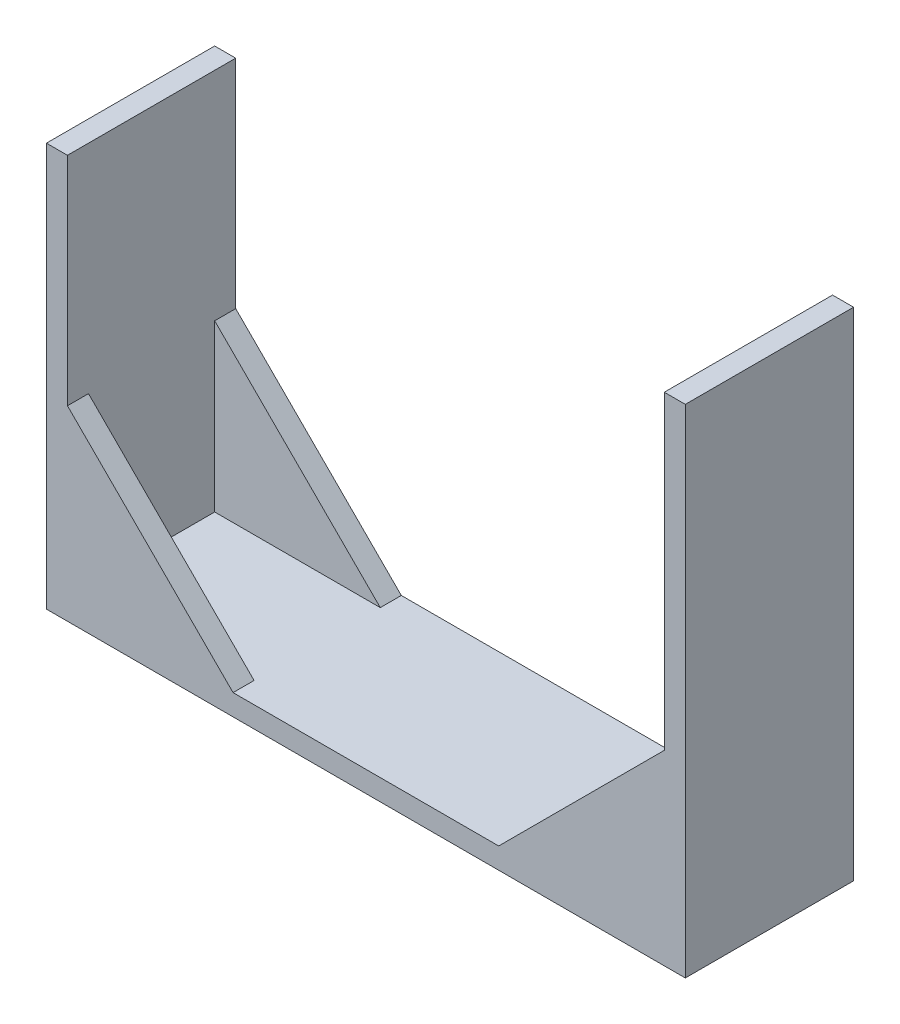
ISO-10303-21;
HEADER;
FILE_DESCRIPTION(('STEP AP214'),'2;1');
FILE_NAME('part.step','',(''),(''),'','','');
FILE_SCHEMA(('AUTOMOTIVE_DESIGN { 1 0 10303 214 1 1 1 1 }'));
ENDSEC;
DATA;
#1=APPLICATION_CONTEXT('core data for automotive mechanical design processes');
#2=APPLICATION_PROTOCOL_DEFINITION('international standard','automotive_design',2000,#1);
#3=PRODUCT_CONTEXT('',#1,'mechanical');
#4=PRODUCT('Part','Part','',(#3));
#5=PRODUCT_RELATED_PRODUCT_CATEGORY('part','',(#4));
#6=PRODUCT_DEFINITION_FORMATION('','',#4);
#7=PRODUCT_DEFINITION_CONTEXT('part definition',#1,'design');
#8=PRODUCT_DEFINITION('design','',#6,#7);
#9=PRODUCT_DEFINITION_SHAPE('','',#8);
#10=(LENGTH_UNIT() NAMED_UNIT(*) SI_UNIT(.MILLI.,.METRE.));
#11=(NAMED_UNIT(*) PLANE_ANGLE_UNIT() SI_UNIT($,.RADIAN.));
#12=(NAMED_UNIT(*) SI_UNIT($,.STERADIAN.) SOLID_ANGLE_UNIT());
#13=UNCERTAINTY_MEASURE_WITH_UNIT(LENGTH_MEASURE(1.E-05),#10,'distance_accuracy_value','');
#14=(GEOMETRIC_REPRESENTATION_CONTEXT(3) GLOBAL_UNCERTAINTY_ASSIGNED_CONTEXT((#13)) GLOBAL_UNIT_ASSIGNED_CONTEXT((#10,
#11,#12)) REPRESENTATION_CONTEXT('',''));
#15=CARTESIAN_POINT('',(0.,0.,0.));
#16=DIRECTION('',(0.,0.,1.));
#17=DIRECTION('',(1.,0.,0.));
#18=AXIS2_PLACEMENT_3D('',#15,#16,#17);
#19=CARTESIAN_POINT('',(12.7,12.7,50.8));
#20=DIRECTION('',(0.,-1.,0.));
#21=DIRECTION('',(0.,0.,-1.));
#22=AXIS2_PLACEMENT_3D('',#19,#20,#21);
#23=PLANE('',#22);
#24=DIRECTION('',(0.,0.,-1.));
#25=VECTOR('',#24,1.);
#26=CARTESIAN_POINT('',(112.699999999999,12.7,-38.1));
#27=LINE('',#26,#25);
#28=CARTESIAN_POINT('',(112.699999999999,12.7,-38.1));
#29=VERTEX_POINT('',#28);
#30=CARTESIAN_POINT('',(112.699999999999,12.7,-50.8));
#31=VERTEX_POINT('',#30);
#32=EDGE_CURVE('E48',#29,#31,#27,.T.);
#33=ORIENTED_EDGE('',*,*,#32,.F.);
#34=DIRECTION('',(1.,0.,0.));
#35=VECTOR('',#34,1.);
#36=CARTESIAN_POINT('',(112.699999999999,12.7,-38.1));
#37=LINE('',#36,#35);
#38=CARTESIAN_POINT('',(12.7,12.7,-38.1));
#39=VERTEX_POINT('',#38);
#40=EDGE_CURVE('E165',#39,#29,#37,.T.);
#41=ORIENTED_EDGE('',*,*,#40,.F.);
#42=DIRECTION('',(0.,0.,-1.));
#43=VECTOR('',#42,1.);
#44=CARTESIAN_POINT('',(12.7,12.7,50.8));
#45=LINE('',#44,#43);
#46=CARTESIAN_POINT('',(12.7,12.7,38.1));
#47=VERTEX_POINT('',#46);
#48=EDGE_CURVE('E260',#47,#39,#45,.T.);
#49=ORIENTED_EDGE('',*,*,#48,.F.);
#50=DIRECTION('',(1.,0.,0.));
#51=VECTOR('',#50,1.);
#52=CARTESIAN_POINT('',(112.699999999999,12.7,38.1));
#53=LINE('',#52,#51);
#54=CARTESIAN_POINT('',(112.699999999999,12.7,38.1));
#55=VERTEX_POINT('',#54);
#56=EDGE_CURVE('E192',#47,#55,#53,.T.);
#57=ORIENTED_EDGE('',*,*,#56,.T.);
#58=DIRECTION('',(0.,0.,1.));
#59=VECTOR('',#58,1.);
#60=CARTESIAN_POINT('',(112.699999999999,12.7,38.1));
#61=LINE('',#60,#59);
#62=CARTESIAN_POINT('',(112.699999999999,12.7,50.8));
#63=VERTEX_POINT('',#62);
#64=EDGE_CURVE('E200',#55,#63,#61,.T.);
#65=ORIENTED_EDGE('',*,*,#64,.T.);
#66=DIRECTION('',(-1.,0.,0.));
#67=VECTOR('',#66,1.);
#68=CARTESIAN_POINT('',(12.7,12.7,50.8));
#69=LINE('',#68,#67);
#70=CARTESIAN_POINT('',(273.100000000001,12.7,50.8));
#71=VERTEX_POINT('',#70);
#72=EDGE_CURVE('E237',#71,#63,#69,.T.);
#73=ORIENTED_EDGE('',*,*,#72,.F.);
#74=DIRECTION('',(0.,0.,1.));
#75=VECTOR('',#74,1.);
#76=CARTESIAN_POINT('',(273.100000000001,12.7,38.1));
#77=LINE('',#76,#75);
#78=CARTESIAN_POINT('',(273.100000000001,12.7,38.1));
#79=VERTEX_POINT('',#78);
#80=EDGE_CURVE('E218',#79,#71,#77,.T.);
#81=ORIENTED_EDGE('',*,*,#80,.F.);
#82=DIRECTION('',(1.,0.,0.));
#83=VECTOR('',#82,1.);
#84=CARTESIAN_POINT('',(273.100000000001,12.7,38.1));
#85=LINE('',#84,#83);
#86=CARTESIAN_POINT('',(373.1,12.7,38.1));
#87=VERTEX_POINT('',#86);
#88=EDGE_CURVE('E213',#79,#87,#85,.T.);
#89=ORIENTED_EDGE('',*,*,#88,.T.);
#90=DIRECTION('',(0.,0.,-1.));
#91=VECTOR('',#90,1.);
#92=CARTESIAN_POINT('',(373.1,12.7,50.8));
#93=LINE('',#92,#91);
#94=CARTESIAN_POINT('',(373.1,12.7,-38.1));
#95=VERTEX_POINT('',#94);
#96=EDGE_CURVE('E262',#87,#95,#93,.T.);
#97=ORIENTED_EDGE('',*,*,#96,.T.);
#98=DIRECTION('',(1.,0.,0.));
#99=VECTOR('',#98,1.);
#100=CARTESIAN_POINT('',(273.100000000001,12.7,-38.1));
#101=LINE('',#100,#99);
#102=CARTESIAN_POINT('',(273.100000000001,12.7,-38.1));
#103=VERTEX_POINT('',#102);
#104=EDGE_CURVE('E177',#103,#95,#101,.T.);
#105=ORIENTED_EDGE('',*,*,#104,.F.);
#106=DIRECTION('',(0.,0.,-1.));
#107=VECTOR('',#106,1.);
#108=CARTESIAN_POINT('',(273.100000000001,12.7,-38.1));
#109=LINE('',#108,#107);
#110=CARTESIAN_POINT('',(273.100000000001,12.7,-50.8));
#111=VERTEX_POINT('',#110);
#112=EDGE_CURVE('E183',#103,#111,#109,.T.);
#113=ORIENTED_EDGE('',*,*,#112,.T.);
#114=DIRECTION('',(-1.,0.,0.));
#115=VECTOR('',#114,1.);
#116=CARTESIAN_POINT('',(12.7,12.7,-50.8));
#117=LINE('',#116,#115);
#118=EDGE_CURVE('E156',#111,#31,#117,.T.);
#119=ORIENTED_EDGE('',*,*,#118,.T.);
#120=EDGE_LOOP('',(#33,#41,#49,#57,#65,#73,#81,#89,#97,#105,#113,#119));
#121=FACE_BOUND('',#120,.T.);
#122=ADVANCED_FACE('F33',(#121),#23,.F.);
#123=CARTESIAN_POINT('',(12.7,12.7,50.8));
#124=DIRECTION('',(-1.,0.,0.));
#125=DIRECTION('',(0.,-1.,0.));
#126=AXIS2_PLACEMENT_3D('',#123,#124,#125);
#127=PLANE('',#126);
#128=DIRECTION('',(0.,0.,-1.));
#129=VECTOR('',#128,1.);
#130=CARTESIAN_POINT('',(12.7,112.7,-38.1));
#131=LINE('',#130,#129);
#132=CARTESIAN_POINT('',(12.7,112.7,-38.1));
#133=VERTEX_POINT('',#132);
#134=CARTESIAN_POINT('',(12.7,112.7,-50.8));
#135=VERTEX_POINT('',#134);
#136=EDGE_CURVE('E159',#133,#135,#131,.T.);
#137=ORIENTED_EDGE('',*,*,#136,.T.);
#138=DIRECTION('',(0.,1.,0.));
#139=VECTOR('',#138,1.);
#140=CARTESIAN_POINT('',(12.7,12.7,-50.8));
#141=LINE('',#140,#139);
#142=CARTESIAN_POINT('',(12.7,243.7,-50.8));
#143=VERTEX_POINT('',#142);
#144=EDGE_CURVE('E148',#135,#143,#141,.T.);
#145=ORIENTED_EDGE('',*,*,#144,.T.);
#146=DIRECTION('',(0.,0.,-1.));
#147=VECTOR('',#146,1.);
#148=CARTESIAN_POINT('',(12.7,243.7,50.8));
#149=LINE('',#148,#147);
#150=CARTESIAN_POINT('',(12.7,243.7,50.8));
#151=VERTEX_POINT('',#150);
#152=EDGE_CURVE('E258',#151,#143,#149,.T.);
#153=ORIENTED_EDGE('',*,*,#152,.F.);
#154=DIRECTION('',(0.,1.,0.));
#155=VECTOR('',#154,1.);
#156=CARTESIAN_POINT('',(12.7,12.7,50.8));
#157=LINE('',#156,#155);
#158=CARTESIAN_POINT('',(12.7,112.7,50.8));
#159=VERTEX_POINT('',#158);
#160=EDGE_CURVE('E240',#159,#151,#157,.T.);
#161=ORIENTED_EDGE('',*,*,#160,.F.);
#162=DIRECTION('',(0.,0.,1.));
#163=VECTOR('',#162,1.);
#164=CARTESIAN_POINT('',(12.7,112.7,38.1));
#165=LINE('',#164,#163);
#166=CARTESIAN_POINT('',(12.7,112.7,38.1));
#167=VERTEX_POINT('',#166);
#168=EDGE_CURVE('E202',#167,#159,#165,.T.);
#169=ORIENTED_EDGE('',*,*,#168,.F.);
#170=DIRECTION('',(0.,-1.,0.));
#171=VECTOR('',#170,1.);
#172=CARTESIAN_POINT('',(12.7,12.7,38.1));
#173=LINE('',#172,#171);
#174=EDGE_CURVE('E197',#167,#47,#173,.T.);
#175=ORIENTED_EDGE('',*,*,#174,.T.);
#176=ORIENTED_EDGE('',*,*,#48,.T.);
#177=DIRECTION('',(0.,-1.,0.));
#178=VECTOR('',#177,1.);
#179=CARTESIAN_POINT('',(12.7,12.7,-38.1));
#180=LINE('',#179,#178);
#181=EDGE_CURVE('E56',#133,#39,#180,.T.);
#182=ORIENTED_EDGE('',*,*,#181,.F.);
#183=EDGE_LOOP('',(#137,#145,#153,#161,#169,#175,#176,#182));
#184=FACE_BOUND('',#183,.T.);
#185=ADVANCED_FACE('F160',(#184),#127,.F.);
#186=CARTESIAN_POINT('',(373.1,12.7,50.8));
#187=DIRECTION('',(1.,0.,0.));
#188=DIRECTION('',(0.,0.,-1.));
#189=AXIS2_PLACEMENT_3D('',#186,#187,#188);
#190=PLANE('',#189);
#191=DIRECTION('',(0.,0.,-1.));
#192=VECTOR('',#191,1.);
#193=CARTESIAN_POINT('',(373.1,112.7,-38.1));
#194=LINE('',#193,#192);
#195=CARTESIAN_POINT('',(373.1,112.7,-38.1));
#196=VERTEX_POINT('',#195);
#197=CARTESIAN_POINT('',(373.1,112.7,-50.8));
#198=VERTEX_POINT('',#197);
#199=EDGE_CURVE('E186',#196,#198,#194,.T.);
#200=ORIENTED_EDGE('',*,*,#199,.F.);
#201=DIRECTION('',(0.,1.,0.));
#202=VECTOR('',#201,1.);
#203=CARTESIAN_POINT('',(373.1,12.7,-38.1));
#204=LINE('',#203,#202);
#205=EDGE_CURVE('E174',#95,#196,#204,.T.);
#206=ORIENTED_EDGE('',*,*,#205,.F.);
#207=ORIENTED_EDGE('',*,*,#96,.F.);
#208=DIRECTION('',(0.,1.,0.));
#209=VECTOR('',#208,1.);
#210=CARTESIAN_POINT('',(373.1,12.7,38.1));
#211=LINE('',#210,#209);
#212=CARTESIAN_POINT('',(373.1,112.7,38.1));
#213=VERTEX_POINT('',#212);
#214=EDGE_CURVE('E208',#87,#213,#211,.T.);
#215=ORIENTED_EDGE('',*,*,#214,.T.);
#216=DIRECTION('',(0.,0.,1.));
#217=VECTOR('',#216,1.);
#218=CARTESIAN_POINT('',(373.1,112.7,38.1));
#219=LINE('',#218,#217);
#220=CARTESIAN_POINT('',(373.1,112.7,50.8));
#221=VERTEX_POINT('',#220);
#222=EDGE_CURVE('E216',#213,#221,#219,.T.);
#223=ORIENTED_EDGE('',*,*,#222,.T.);
#224=DIRECTION('',(0.,-1.,0.));
#225=VECTOR('',#224,1.);
#226=CARTESIAN_POINT('',(373.1,12.7,50.8));
#227=LINE('',#226,#225);
#228=CARTESIAN_POINT('',(373.1,300.,50.8));
#229=VERTEX_POINT('',#228);
#230=EDGE_CURVE('E234',#229,#221,#227,.T.);
#231=ORIENTED_EDGE('',*,*,#230,.F.);
#232=DIRECTION('',(0.,0.,-1.));
#233=VECTOR('',#232,1.);
#234=CARTESIAN_POINT('',(373.1,300.,50.8));
#235=LINE('',#234,#233);
#236=CARTESIAN_POINT('',(373.1,300.,-50.8));
#237=VERTEX_POINT('',#236);
#238=EDGE_CURVE('E265',#229,#237,#235,.T.);
#239=ORIENTED_EDGE('',*,*,#238,.T.);
#240=DIRECTION('',(0.,-1.,0.));
#241=VECTOR('',#240,1.);
#242=CARTESIAN_POINT('',(373.1,12.7,-50.8));
#243=LINE('',#242,#241);
#244=EDGE_CURVE('E251',#237,#198,#243,.T.);
#245=ORIENTED_EDGE('',*,*,#244,.T.);
#246=EDGE_LOOP('',(#200,#206,#207,#215,#223,#231,#239,#245));
#247=FACE_BOUND('',#246,.T.);
#248=ADVANCED_FACE('F288',(#247),#190,.F.);
#249=CARTESIAN_POINT('',(0.,0.,50.8));
#250=DIRECTION('',(0.,1.,0.));
#251=DIRECTION('',(0.,0.,1.));
#252=AXIS2_PLACEMENT_3D('',#249,#250,#251);
#253=PLANE('',#252);
#254=DIRECTION('',(1.,0.,0.));
#255=VECTOR('',#254,1.);
#256=CARTESIAN_POINT('',(0.,0.,-50.8));
#257=LINE('',#256,#255);
#258=CARTESIAN_POINT('',(0.,0.,-50.8));
#259=VERTEX_POINT('',#258);
#260=CARTESIAN_POINT('',(385.8,0.,-50.8));
#261=VERTEX_POINT('',#260);
#262=EDGE_CURVE('E221',#259,#261,#257,.T.);
#263=ORIENTED_EDGE('',*,*,#262,.T.);
#264=DIRECTION('',(0.,0.,-1.));
#265=VECTOR('',#264,1.);
#266=CARTESIAN_POINT('',(385.8,0.,50.8));
#267=LINE('',#266,#265);
#268=CARTESIAN_POINT('',(385.8,0.,50.8));
#269=VERTEX_POINT('',#268);
#270=EDGE_CURVE('E41',#269,#261,#267,.T.);
#271=ORIENTED_EDGE('',*,*,#270,.F.);
#272=DIRECTION('',(1.,0.,0.));
#273=VECTOR('',#272,1.);
#274=CARTESIAN_POINT('',(0.,0.,50.8));
#275=LINE('',#274,#273);
#276=CARTESIAN_POINT('',(0.,0.,50.8));
#277=VERTEX_POINT('',#276);
#278=EDGE_CURVE('E227',#277,#269,#275,.T.);
#279=ORIENTED_EDGE('',*,*,#278,.F.);
#280=DIRECTION('',(0.,0.,-1.));
#281=VECTOR('',#280,1.);
#282=CARTESIAN_POINT('',(0.,0.,50.8));
#283=LINE('',#282,#281);
#284=EDGE_CURVE('E11',#277,#259,#283,.T.);
#285=ORIENTED_EDGE('',*,*,#284,.T.);
#286=EDGE_LOOP('',(#263,#271,#279,#285));
#287=FACE_BOUND('',#286,.T.);
#288=ADVANCED_FACE('F35',(#287),#253,.F.);
#289=CARTESIAN_POINT('',(385.8,0.,50.8));
#290=DIRECTION('',(-1.,0.,0.));
#291=DIRECTION('',(0.,0.,1.));
#292=AXIS2_PLACEMENT_3D('',#289,#290,#291);
#293=PLANE('',#292);
#294=DIRECTION('',(0.,1.,0.));
#295=VECTOR('',#294,1.);
#296=CARTESIAN_POINT('',(385.8,0.,-50.8));
#297=LINE('',#296,#295);
#298=CARTESIAN_POINT('',(385.8,300.,-50.8));
#299=VERTEX_POINT('',#298);
#300=EDGE_CURVE('E247',#261,#299,#297,.T.);
#301=ORIENTED_EDGE('',*,*,#300,.T.);
#302=DIRECTION('',(0.,0.,-1.));
#303=VECTOR('',#302,1.);
#304=CARTESIAN_POINT('',(385.8,300.,50.8));
#305=LINE('',#304,#303);
#306=CARTESIAN_POINT('',(385.8,300.,50.8));
#307=VERTEX_POINT('',#306);
#308=EDGE_CURVE('E268',#307,#299,#305,.T.);
#309=ORIENTED_EDGE('',*,*,#308,.F.);
#310=DIRECTION('',(0.,1.,0.));
#311=VECTOR('',#310,1.);
#312=CARTESIAN_POINT('',(385.8,0.,50.8));
#313=LINE('',#312,#311);
#314=EDGE_CURVE('E230',#269,#307,#313,.T.);
#315=ORIENTED_EDGE('',*,*,#314,.F.);
#316=ORIENTED_EDGE('',*,*,#270,.T.);
#317=EDGE_LOOP('',(#301,#309,#315,#316));
#318=FACE_BOUND('',#317,.T.);
#319=ADVANCED_FACE('F275',(#318),#293,.F.);
#320=CARTESIAN_POINT('',(385.8,300.,50.8));
#321=DIRECTION('',(0.,-1.,0.));
#322=DIRECTION('',(0.,0.,-1.));
#323=AXIS2_PLACEMENT_3D('',#320,#321,#322);
#324=PLANE('',#323);
#325=DIRECTION('',(-1.,0.,0.));
#326=VECTOR('',#325,1.);
#327=CARTESIAN_POINT('',(385.8,300.,-50.8));
#328=LINE('',#327,#326);
#329=EDGE_CURVE('E249',#299,#237,#328,.T.);
#330=ORIENTED_EDGE('',*,*,#329,.T.);
#331=ORIENTED_EDGE('',*,*,#238,.F.);
#332=DIRECTION('',(-1.,0.,0.));
#333=VECTOR('',#332,1.);
#334=CARTESIAN_POINT('',(385.8,300.,50.8));
#335=LINE('',#334,#333);
#336=EDGE_CURVE('E232',#307,#229,#335,.T.);
#337=ORIENTED_EDGE('',*,*,#336,.F.);
#338=ORIENTED_EDGE('',*,*,#308,.T.);
#339=EDGE_LOOP('',(#330,#331,#337,#338));
#340=FACE_BOUND('',#339,.T.);
#341=ADVANCED_FACE('F284',(#340),#324,.F.);
#342=CARTESIAN_POINT('',(12.7,243.7,50.8));
#343=DIRECTION('',(0.,-1.,0.));
#344=DIRECTION('',(0.,0.,-1.));
#345=AXIS2_PLACEMENT_3D('',#342,#343,#344);
#346=PLANE('',#345);
#347=DIRECTION('',(-1.,0.,0.));
#348=VECTOR('',#347,1.);
#349=CARTESIAN_POINT('',(12.7,243.7,-50.8));
#350=LINE('',#349,#348);
#351=CARTESIAN_POINT('',(0.,243.7,-50.8));
#352=VERTEX_POINT('',#351);
#353=EDGE_CURVE('E153',#143,#352,#350,.T.);
#354=ORIENTED_EDGE('',*,*,#353,.T.);
#355=DIRECTION('',(0.,0.,-1.));
#356=VECTOR('',#355,1.);
#357=CARTESIAN_POINT('',(0.,243.7,50.8));
#358=LINE('',#357,#356);
#359=CARTESIAN_POINT('',(0.,243.7,50.8));
#360=VERTEX_POINT('',#359);
#361=EDGE_CURVE('E245',#360,#352,#358,.T.);
#362=ORIENTED_EDGE('',*,*,#361,.F.);
#363=DIRECTION('',(-1.,0.,0.));
#364=VECTOR('',#363,1.);
#365=CARTESIAN_POINT('',(12.7,243.7,50.8));
#366=LINE('',#365,#364);
#367=EDGE_CURVE('E242',#151,#360,#366,.T.);
#368=ORIENTED_EDGE('',*,*,#367,.F.);
#369=ORIENTED_EDGE('',*,*,#152,.T.);
#370=EDGE_LOOP('',(#354,#362,#368,#369));
#371=FACE_BOUND('',#370,.T.);
#372=ADVANCED_FACE('F297',(#371),#346,.F.);
#373=CARTESIAN_POINT('',(0.,243.7,50.8));
#374=DIRECTION('',(1.,0.,0.));
#375=DIRECTION('',(0.,1.,0.));
#376=AXIS2_PLACEMENT_3D('',#373,#374,#375);
#377=PLANE('',#376);
#378=DIRECTION('',(0.,-1.,0.));
#379=VECTOR('',#378,1.);
#380=CARTESIAN_POINT('',(0.,243.7,-50.8));
#381=LINE('',#380,#379);
#382=EDGE_CURVE('E228',#352,#259,#381,.T.);
#383=ORIENTED_EDGE('',*,*,#382,.T.);
#384=ORIENTED_EDGE('',*,*,#284,.F.);
#385=DIRECTION('',(0.,-1.,0.));
#386=VECTOR('',#385,1.);
#387=CARTESIAN_POINT('',(0.,0.,50.8));
#388=LINE('',#387,#386);
#389=EDGE_CURVE('E224',#360,#277,#388,.T.);
#390=ORIENTED_EDGE('',*,*,#389,.F.);
#391=ORIENTED_EDGE('',*,*,#361,.T.);
#392=EDGE_LOOP('',(#383,#384,#390,#391));
#393=FACE_BOUND('',#392,.T.);
#394=ADVANCED_FACE('F293',(#393),#377,.F.);
#395=CARTESIAN_POINT('',(0.,0.,50.8));
#396=DIRECTION('',(0.,0.,1.));
#397=DIRECTION('',(1.,0.,0.));
#398=AXIS2_PLACEMENT_3D('',#395,#396,#397);
#399=PLANE('',#398);
#400=ORIENTED_EDGE('',*,*,#72,.T.);
#401=DIRECTION('',(-0.707106781186544,0.707106781186551,0.));
#402=VECTOR('',#401,1.);
#403=CARTESIAN_POINT('',(12.7,112.7,50.8));
#404=LINE('',#403,#402);
#405=EDGE_CURVE('E189',#63,#159,#404,.T.);
#406=ORIENTED_EDGE('',*,*,#405,.T.);
#407=ORIENTED_EDGE('',*,*,#160,.T.);
#408=ORIENTED_EDGE('',*,*,#367,.T.);
#409=ORIENTED_EDGE('',*,*,#389,.T.);
#410=ORIENTED_EDGE('',*,*,#278,.T.);
#411=ORIENTED_EDGE('',*,*,#314,.T.);
#412=ORIENTED_EDGE('',*,*,#336,.T.);
#413=ORIENTED_EDGE('',*,*,#230,.T.);
#414=DIRECTION('',(-0.707106781186544,-0.707106781186551,0.));
#415=VECTOR('',#414,1.);
#416=CARTESIAN_POINT('',(373.1,112.7,50.8));
#417=LINE('',#416,#415);
#418=EDGE_CURVE('E205',#221,#71,#417,.T.);
#419=ORIENTED_EDGE('',*,*,#418,.T.);
#420=EDGE_LOOP('',(#400,#406,#407,#408,#409,#410,#411,#412,#413,#419));
#421=FACE_BOUND('',#420,.T.);
#422=ADVANCED_FACE('F290',(#421),#399,.T.);
#423=CARTESIAN_POINT('',(0.,0.,-50.8));
#424=DIRECTION('',(0.,0.,1.));
#425=DIRECTION('',(1.,0.,0.));
#426=AXIS2_PLACEMENT_3D('',#423,#424,#425);
#427=PLANE('',#426);
#428=DIRECTION('',(-0.707106781186544,0.707106781186551,0.));
#429=VECTOR('',#428,1.);
#430=CARTESIAN_POINT('',(12.7,112.7,-50.8));
#431=LINE('',#430,#429);
#432=EDGE_CURVE('E151',#31,#135,#431,.T.);
#433=ORIENTED_EDGE('',*,*,#432,.F.);
#434=ORIENTED_EDGE('',*,*,#118,.F.);
#435=DIRECTION('',(-0.707106781186544,-0.707106781186551,0.));
#436=VECTOR('',#435,1.);
#437=CARTESIAN_POINT('',(373.1,112.7,-50.8));
#438=LINE('',#437,#436);
#439=EDGE_CURVE('E172',#198,#111,#438,.T.);
#440=ORIENTED_EDGE('',*,*,#439,.F.);
#441=ORIENTED_EDGE('',*,*,#244,.F.);
#442=ORIENTED_EDGE('',*,*,#329,.F.);
#443=ORIENTED_EDGE('',*,*,#300,.F.);
#444=ORIENTED_EDGE('',*,*,#262,.F.);
#445=ORIENTED_EDGE('',*,*,#382,.F.);
#446=ORIENTED_EDGE('',*,*,#353,.F.);
#447=ORIENTED_EDGE('',*,*,#144,.F.);
#448=EDGE_LOOP('',(#433,#434,#440,#441,#442,#443,#444,#445,#446,#447));
#449=FACE_BOUND('',#448,.T.);
#450=ADVANCED_FACE('F149',(#449),#427,.F.);
#451=CARTESIAN_POINT('',(373.1,112.7,38.1));
#452=DIRECTION('',(-0.707106781186551,0.707106781186544,0.));
#453=DIRECTION('',(-0.707106781186544,-0.707106781186551,0.));
#454=AXIS2_PLACEMENT_3D('',#451,#452,#453);
#455=PLANE('',#454);
#456=ORIENTED_EDGE('',*,*,#418,.F.);
#457=ORIENTED_EDGE('',*,*,#222,.F.);
#458=DIRECTION('',(-0.707106781186544,-0.707106781186551,0.));
#459=VECTOR('',#458,1.);
#460=CARTESIAN_POINT('',(373.1,112.7,38.1));
#461=LINE('',#460,#459);
#462=EDGE_CURVE('E211',#213,#79,#461,.T.);
#463=ORIENTED_EDGE('',*,*,#462,.T.);
#464=ORIENTED_EDGE('',*,*,#80,.T.);
#465=EDGE_LOOP('',(#456,#457,#463,#464));
#466=FACE_BOUND('',#465,.T.);
#467=ADVANCED_FACE('F376',(#466),#455,.T.);
#468=CARTESIAN_POINT('',(0.,0.,38.1));
#469=DIRECTION('',(0.,0.,-1.));
#470=DIRECTION('',(-1.,0.,0.));
#471=AXIS2_PLACEMENT_3D('',#468,#469,#470);
#472=PLANE('',#471);
#473=ORIENTED_EDGE('',*,*,#214,.F.);
#474=ORIENTED_EDGE('',*,*,#88,.F.);
#475=ORIENTED_EDGE('',*,*,#462,.F.);
#476=EDGE_LOOP('',(#473,#474,#475));
#477=FACE_BOUND('',#476,.T.);
#478=ADVANCED_FACE('F367',(#477),#472,.T.);
#479=CARTESIAN_POINT('',(12.7,112.7,38.1));
#480=DIRECTION('',(0.707106781186551,0.707106781186544,0.));
#481=DIRECTION('',(-0.707106781186544,0.707106781186551,0.));
#482=AXIS2_PLACEMENT_3D('',#479,#480,#481);
#483=PLANE('',#482);
#484=ORIENTED_EDGE('',*,*,#405,.F.);
#485=ORIENTED_EDGE('',*,*,#64,.F.);
#486=DIRECTION('',(-0.707106781186544,0.707106781186551,0.));
#487=VECTOR('',#486,1.);
#488=CARTESIAN_POINT('',(12.7,112.7,38.1));
#489=LINE('',#488,#487);
#490=EDGE_CURVE('E195',#55,#167,#489,.T.);
#491=ORIENTED_EDGE('',*,*,#490,.T.);
#492=ORIENTED_EDGE('',*,*,#168,.T.);
#493=EDGE_LOOP('',(#484,#485,#491,#492));
#494=FACE_BOUND('',#493,.T.);
#495=ADVANCED_FACE('F302',(#494),#483,.T.);
#496=CARTESIAN_POINT('',(0.,0.,38.1));
#497=DIRECTION('',(0.,0.,-1.));
#498=DIRECTION('',(-1.,0.,0.));
#499=AXIS2_PLACEMENT_3D('',#496,#497,#498);
#500=PLANE('',#499);
#501=ORIENTED_EDGE('',*,*,#56,.F.);
#502=ORIENTED_EDGE('',*,*,#174,.F.);
#503=ORIENTED_EDGE('',*,*,#490,.F.);
#504=EDGE_LOOP('',(#501,#502,#503));
#505=FACE_BOUND('',#504,.T.);
#506=ADVANCED_FACE('F306',(#505),#500,.T.);
#507=CARTESIAN_POINT('',(373.1,112.7,-38.1));
#508=DIRECTION('',(0.707106781186551,-0.707106781186544,0.));
#509=DIRECTION('',(0.707106781186544,0.707106781186551,0.));
#510=AXIS2_PLACEMENT_3D('',#507,#508,#509);
#511=PLANE('',#510);
#512=ORIENTED_EDGE('',*,*,#439,.T.);
#513=ORIENTED_EDGE('',*,*,#112,.F.);
#514=DIRECTION('',(-0.707106781186544,-0.707106781186551,0.));
#515=VECTOR('',#514,1.);
#516=CARTESIAN_POINT('',(373.1,112.7,-38.1));
#517=LINE('',#516,#515);
#518=EDGE_CURVE('E180',#196,#103,#517,.T.);
#519=ORIENTED_EDGE('',*,*,#518,.F.);
#520=ORIENTED_EDGE('',*,*,#199,.T.);
#521=EDGE_LOOP('',(#512,#513,#519,#520));
#522=FACE_BOUND('',#521,.T.);
#523=ADVANCED_FACE('F357',(#522),#511,.F.);
#524=CARTESIAN_POINT('',(0.,0.,-38.1));
#525=DIRECTION('',(0.,0.,1.));
#526=DIRECTION('',(-1.,0.,0.));
#527=AXIS2_PLACEMENT_3D('',#524,#525,#526);
#528=PLANE('',#527);
#529=ORIENTED_EDGE('',*,*,#205,.T.);
#530=ORIENTED_EDGE('',*,*,#518,.T.);
#531=ORIENTED_EDGE('',*,*,#104,.T.);
#532=EDGE_LOOP('',(#529,#530,#531));
#533=FACE_BOUND('',#532,.T.);
#534=ADVANCED_FACE('F315',(#533),#528,.T.);
#535=CARTESIAN_POINT('',(12.7,112.7,-38.1));
#536=DIRECTION('',(-0.707106781186551,-0.707106781186544,0.));
#537=DIRECTION('',(0.707106781186544,-0.707106781186551,0.));
#538=AXIS2_PLACEMENT_3D('',#535,#536,#537);
#539=PLANE('',#538);
#540=ORIENTED_EDGE('',*,*,#432,.T.);
#541=ORIENTED_EDGE('',*,*,#136,.F.);
#542=DIRECTION('',(-0.707106781186544,0.707106781186551,0.));
#543=VECTOR('',#542,1.);
#544=CARTESIAN_POINT('',(12.7,112.7,-38.1));
#545=LINE('',#544,#543);
#546=EDGE_CURVE('E162',#29,#133,#545,.T.);
#547=ORIENTED_EDGE('',*,*,#546,.F.);
#548=ORIENTED_EDGE('',*,*,#32,.T.);
#549=EDGE_LOOP('',(#540,#541,#547,#548));
#550=FACE_BOUND('',#549,.T.);
#551=ADVANCED_FACE('F164',(#550),#539,.F.);
#552=CARTESIAN_POINT('',(0.,0.,-38.1));
#553=DIRECTION('',(0.,0.,1.));
#554=DIRECTION('',(-1.,0.,0.));
#555=AXIS2_PLACEMENT_3D('',#552,#553,#554);
#556=PLANE('',#555);
#557=ORIENTED_EDGE('',*,*,#40,.T.);
#558=ORIENTED_EDGE('',*,*,#546,.T.);
#559=ORIENTED_EDGE('',*,*,#181,.T.);
#560=EDGE_LOOP('',(#557,#558,#559));
#561=FACE_BOUND('',#560,.T.);
#562=ADVANCED_FACE('F309',(#561),#556,.T.);
#563=CLOSED_SHELL('',(#122,#185,#248,#288,#319,#341,#372,#394,#422,#450,#467,#478,#495,#506,
#523,#534,#551,#562));
#564=MANIFOLD_SOLID_BREP('B2',#563);
#565=ADVANCED_BREP_SHAPE_REPRESENTATION('',(#18,#564),#14);
#566=SHAPE_DEFINITION_REPRESENTATION(#9,#565);
ENDSEC;
END-ISO-10303-21;
